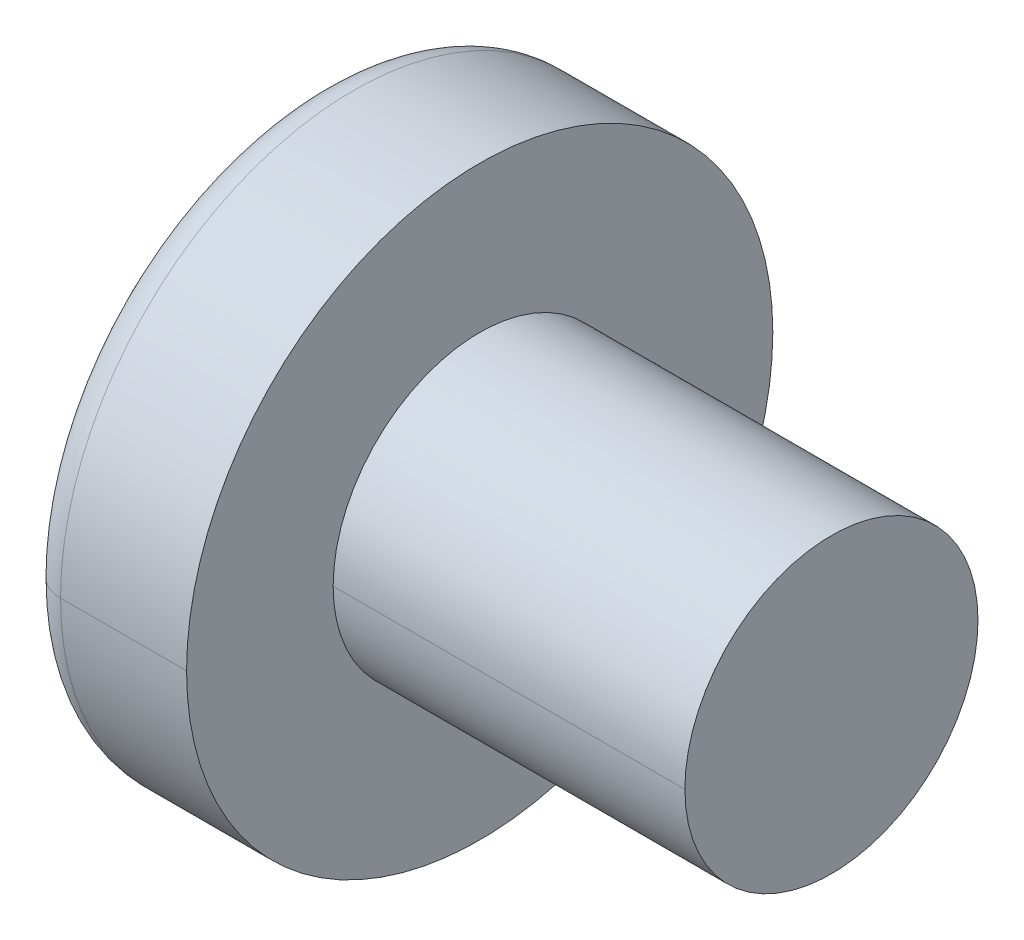
ISO-10303-21;
HEADER;
FILE_DESCRIPTION(('STEP AP214'),'2;1');
FILE_NAME('part.step','',(''),(''),'','','');
FILE_SCHEMA(('AUTOMOTIVE_DESIGN { 1 0 10303 214 1 1 1 1 }'));
ENDSEC;
DATA;
#1=APPLICATION_CONTEXT('core data for automotive mechanical design processes');
#2=APPLICATION_PROTOCOL_DEFINITION('international standard','automotive_design',2000,#1);
#3=PRODUCT_CONTEXT('',#1,'mechanical');
#4=PRODUCT('Part','Part','',(#3));
#5=PRODUCT_RELATED_PRODUCT_CATEGORY('part','',(#4));
#6=PRODUCT_DEFINITION_FORMATION('','',#4);
#7=PRODUCT_DEFINITION_CONTEXT('part definition',#1,'design');
#8=PRODUCT_DEFINITION('design','',#6,#7);
#9=PRODUCT_DEFINITION_SHAPE('','',#8);
#10=(LENGTH_UNIT() NAMED_UNIT(*) SI_UNIT(.MILLI.,.METRE.));
#11=(NAMED_UNIT(*) PLANE_ANGLE_UNIT() SI_UNIT($,.RADIAN.));
#12=(NAMED_UNIT(*) SI_UNIT($,.STERADIAN.) SOLID_ANGLE_UNIT());
#13=UNCERTAINTY_MEASURE_WITH_UNIT(LENGTH_MEASURE(1.E-05),#10,'distance_accuracy_value','');
#14=(GEOMETRIC_REPRESENTATION_CONTEXT(3) GLOBAL_UNCERTAINTY_ASSIGNED_CONTEXT((#13)) GLOBAL_UNIT_ASSIGNED_CONTEXT((#10,
#11,#12)) REPRESENTATION_CONTEXT('',''));
#15=CARTESIAN_POINT('',(0.,0.,0.));
#16=DIRECTION('',(0.,0.,1.));
#17=DIRECTION('',(1.,0.,0.));
#18=AXIS2_PLACEMENT_3D('',#15,#16,#17);
#19=CARTESIAN_POINT('',(1.0251050438713,0.,0.));
#20=DIRECTION('',(-1.,0.,0.));
#21=DIRECTION('',(0.,0.,1.));
#22=AXIS2_PLACEMENT_3D('',#19,#20,#21);
#23=TOROIDAL_SURFACE('',#22,2.2,0.3);
#24=CARTESIAN_POINT('',(1.0251050438713,0.,0.));
#25=DIRECTION('',(-1.,0.,0.));
#26=DIRECTION('',(0.,0.,1.));
#27=AXIS2_PLACEMENT_3D('',#24,#25,#26);
#28=CIRCLE('',#27,2.5);
#29=CARTESIAN_POINT('',(1.0251050438713,0.,2.5));
#30=VERTEX_POINT('',#29);
#31=CARTESIAN_POINT('',(1.0251050438713,0.,-2.5));
#32=VERTEX_POINT('',#31);
#33=EDGE_CURVE('E11',#30,#32,#28,.T.);
#34=ORIENTED_EDGE('',*,*,#33,.T.);
#35=CARTESIAN_POINT('',(1.0251050438713,0.,-2.2));
#36=DIRECTION('',(0.,1.,0.));
#37=DIRECTION('',(0.,0.,1.));
#38=AXIS2_PLACEMENT_3D('',#35,#36,#37);
#39=CIRCLE('',#38,0.3);
#40=CARTESIAN_POINT('',(0.783897344725726,0.,-2.37837837837838));
#41=VERTEX_POINT('',#40);
#42=EDGE_CURVE('E28',#32,#41,#39,.T.);
#43=ORIENTED_EDGE('',*,*,#42,.T.);
#44=CARTESIAN_POINT('',(0.783897344725726,0.,0.));
#45=DIRECTION('',(-1.,0.,0.));
#46=DIRECTION('',(0.,0.,1.));
#47=AXIS2_PLACEMENT_3D('',#44,#45,#46);
#48=CIRCLE('',#47,2.37837837837838);
#49=CARTESIAN_POINT('',(0.783897344725726,2.37837837837838,0.));
#50=VERTEX_POINT('',#49);
#51=EDGE_CURVE('E242',#50,#41,#48,.T.);
#52=ORIENTED_EDGE('',*,*,#51,.F.);
#53=CARTESIAN_POINT('',(0.783897344725726,0.,0.));
#54=DIRECTION('',(-1.,0.,0.));
#55=DIRECTION('',(0.,0.,1.));
#56=AXIS2_PLACEMENT_3D('',#53,#54,#55);
#57=CIRCLE('',#56,2.37837837837838);
#58=CARTESIAN_POINT('',(0.783897344725726,0.,2.37837837837838));
#59=VERTEX_POINT('',#58);
#60=EDGE_CURVE('E280',#59,#50,#57,.T.);
#61=ORIENTED_EDGE('',*,*,#60,.F.);
#62=CARTESIAN_POINT('',(1.0251050438713,0.,2.2));
#63=DIRECTION('',(0.,-1.,0.));
#64=DIRECTION('',(0.,0.,-1.));
#65=AXIS2_PLACEMENT_3D('',#62,#63,#64);
#66=CIRCLE('',#65,0.3);
#67=EDGE_CURVE('E204',#30,#59,#66,.T.);
#68=ORIENTED_EDGE('',*,*,#67,.F.);
#69=EDGE_LOOP('',(#34,#43,#52,#61,#68));
#70=FACE_BOUND('',#69,.T.);
#71=ADVANCED_FACE('F17',(#70),#23,.T.);
#72=CARTESIAN_POINT('',(-25.4,0.,0.));
#73=DIRECTION('',(-1.,0.,0.));
#74=DIRECTION('',(0.,0.,1.));
#75=AXIS2_PLACEMENT_3D('',#72,#73,#74);
#76=CYLINDRICAL_SURFACE('',#75,2.5);
#77=CARTESIAN_POINT('',(2.1,0.,0.));
#78=DIRECTION('',(-1.,0.,0.));
#79=DIRECTION('',(0.,0.,1.));
#80=AXIS2_PLACEMENT_3D('',#77,#78,#79);
#81=CIRCLE('',#80,2.5);
#82=CARTESIAN_POINT('',(2.1,0.,2.5));
#83=VERTEX_POINT('',#82);
#84=CARTESIAN_POINT('',(2.1,0.,-2.5));
#85=VERTEX_POINT('',#84);
#86=EDGE_CURVE('E214',#83,#85,#81,.T.);
#87=ORIENTED_EDGE('',*,*,#86,.T.);
#88=DIRECTION('',(-1.,0.,0.));
#89=VECTOR('',#88,1.);
#90=CARTESIAN_POINT('',(-25.4,0.,-2.5));
#91=LINE('',#90,#89);
#92=EDGE_CURVE('E43',#85,#32,#91,.T.);
#93=ORIENTED_EDGE('',*,*,#92,.T.);
#94=ORIENTED_EDGE('',*,*,#33,.F.);
#95=DIRECTION('',(-1.,0.,0.));
#96=VECTOR('',#95,1.);
#97=CARTESIAN_POINT('',(-25.4,0.,2.5));
#98=LINE('',#97,#96);
#99=EDGE_CURVE('E73',#83,#30,#98,.T.);
#100=ORIENTED_EDGE('',*,*,#99,.F.);
#101=EDGE_LOOP('',(#87,#93,#94,#100));
#102=FACE_BOUND('',#101,.T.);
#103=ADVANCED_FACE('F388',(#102),#76,.T.);
#104=CARTESIAN_POINT('',(-25.4,0.,0.));
#105=DIRECTION('',(-1.,0.,0.));
#106=DIRECTION('',(0.,0.,1.));
#107=AXIS2_PLACEMENT_3D('',#104,#105,#106);
#108=CYLINDRICAL_SURFACE('',#107,1.25);
#109=CARTESIAN_POINT('',(5.1,0.,0.));
#110=DIRECTION('',(-1.,0.,0.));
#111=DIRECTION('',(0.,0.,1.));
#112=AXIS2_PLACEMENT_3D('',#109,#110,#111);
#113=CIRCLE('',#112,1.25);
#114=CARTESIAN_POINT('',(5.1,0.,1.25));
#115=VERTEX_POINT('',#114);
#116=CARTESIAN_POINT('',(5.1,0.,-1.25));
#117=VERTEX_POINT('',#116);
#118=EDGE_CURVE('E298',#115,#117,#113,.T.);
#119=ORIENTED_EDGE('',*,*,#118,.T.);
#120=DIRECTION('',(-1.,0.,0.));
#121=VECTOR('',#120,1.);
#122=CARTESIAN_POINT('',(-25.4,0.,-1.25));
#123=LINE('',#122,#121);
#124=CARTESIAN_POINT('',(2.1,0.,-1.25));
#125=VERTEX_POINT('',#124);
#126=EDGE_CURVE('E245',#117,#125,#123,.T.);
#127=ORIENTED_EDGE('',*,*,#126,.T.);
#128=CARTESIAN_POINT('',(2.1,0.,0.));
#129=DIRECTION('',(-1.,0.,0.));
#130=DIRECTION('',(0.,0.,1.));
#131=AXIS2_PLACEMENT_3D('',#128,#129,#130);
#132=CIRCLE('',#131,1.25);
#133=CARTESIAN_POINT('',(2.1,0.,1.25));
#134=VERTEX_POINT('',#133);
#135=EDGE_CURVE('E230',#134,#125,#132,.T.);
#136=ORIENTED_EDGE('',*,*,#135,.F.);
#137=DIRECTION('',(-1.,0.,0.));
#138=VECTOR('',#137,1.);
#139=CARTESIAN_POINT('',(-25.4,0.,1.25));
#140=LINE('',#139,#138);
#141=EDGE_CURVE('E263',#115,#134,#140,.T.);
#142=ORIENTED_EDGE('',*,*,#141,.F.);
#143=EDGE_LOOP('',(#119,#127,#136,#142));
#144=FACE_BOUND('',#143,.T.);
#145=ADVANCED_FACE('F635',(#144),#108,.T.);
#146=CARTESIAN_POINT('',(4.,0.,0.));
#147=DIRECTION('',(0.,0.,-1.));
#148=DIRECTION('',(0.,1.,0.));
#149=AXIS2_PLACEMENT_3D('',#146,#147,#148);
#150=SPHERICAL_SURFACE('',#149,4.);
#151=ORIENTED_EDGE('',*,*,#51,.T.);
#152=CARTESIAN_POINT('',(0.783897344725726,0.,0.));
#153=DIRECTION('',(-1.,0.,0.));
#154=DIRECTION('',(0.,0.,1.));
#155=AXIS2_PLACEMENT_3D('',#152,#153,#154);
#156=CIRCLE('',#155,2.37837837837838);
#157=CARTESIAN_POINT('',(0.783897344725726,-2.37837837837838,0.));
#158=VERTEX_POINT('',#157);
#159=EDGE_CURVE('E241',#41,#158,#156,.T.);
#160=ORIENTED_EDGE('',*,*,#159,.T.);
#161=CARTESIAN_POINT('',(4.,0.,0.));
#162=DIRECTION('',(0.,0.,-1.));
#163=DIRECTION('',(0.,1.,0.));
#164=AXIS2_PLACEMENT_3D('',#161,#162,#163);
#165=CIRCLE('',#164,4.);
#166=CARTESIAN_POINT('',(0.184169682474743,-1.19976622216792,0.));
#167=VERTEX_POINT('',#166);
#168=EDGE_CURVE('E238',#158,#167,#165,.T.);
#169=ORIENTED_EDGE('',*,*,#168,.T.);
#170=CARTESIAN_POINT('',(3.17784904512422,1.07973473043772,0.));
#171=DIRECTION('',(0.605808178465614,-0.795610740817502,0.));
#172=DIRECTION('',(0.795610740817502,0.605808178465614,0.));
#173=AXIS2_PLACEMENT_3D('',#170,#171,#172);
#174=CIRCLE('',#173,3.76274377539628);
#175=CARTESIAN_POINT('',(0.195539940029893,-1.19110847703606,-0.327634320584816));
#176=VERTEX_POINT('',#175);
#177=EDGE_CURVE('E186',#167,#176,#174,.T.);
#178=ORIENTED_EDGE('',*,*,#177,.T.);
#179=CARTESIAN_POINT('',(3.98786118636742,0.,0.106127913473398));
#180=DIRECTION('',(-0.11363816050966,0.,0.993522203313031));
#181=DIRECTION('',(0.993522203313031,0.,0.11363816050966));
#182=AXIS2_PLACEMENT_3D('',#179,#180,#181);
#183=CIRCLE('',#182,3.99857343501221);
#184=CARTESIAN_POINT('',(0.0301382525496408,-0.346552814250857,-0.346552814250858));
#185=VERTEX_POINT('',#184);
#186=EDGE_CURVE('E220',#185,#176,#183,.T.);
#187=ORIENTED_EDGE('',*,*,#186,.F.);
#188=CARTESIAN_POINT('',(3.98786118636742,0.106127913473398,0.));
#189=DIRECTION('',(-0.11363816050966,0.993522203313031,0.));
#190=DIRECTION('',(-0.993522203313031,-0.11363816050966,0.));
#191=AXIS2_PLACEMENT_3D('',#188,#189,#190);
#192=CIRCLE('',#191,3.99857343501221);
#193=CARTESIAN_POINT('',(0.195539940029893,-0.327634320584812,-1.19110847703606));
#194=VERTEX_POINT('',#193);
#195=EDGE_CURVE('E252',#194,#185,#192,.T.);
#196=ORIENTED_EDGE('',*,*,#195,.F.);
#197=CARTESIAN_POINT('',(3.17784904512422,0.,1.07973473043772));
#198=DIRECTION('',(0.605808178465614,0.,-0.795610740817502));
#199=DIRECTION('',(-0.795610740817502,0.,-0.605808178465614));
#200=AXIS2_PLACEMENT_3D('',#197,#198,#199);
#201=CIRCLE('',#200,3.76274377539628);
#202=CARTESIAN_POINT('',(0.195539940029893,0.327634320584821,-1.19110847703606));
#203=VERTEX_POINT('',#202);
#204=EDGE_CURVE('E250',#194,#203,#201,.T.);
#205=ORIENTED_EDGE('',*,*,#204,.T.);
#206=CARTESIAN_POINT('',(3.98786118636742,-0.106127913473398,0.));
#207=DIRECTION('',(-0.11363816050966,-0.993522203313031,0.));
#208=DIRECTION('',(0.993522203313031,-0.11363816050966,0.));
#209=AXIS2_PLACEMENT_3D('',#206,#207,#208);
#210=CIRCLE('',#209,3.99857343501221);
#211=CARTESIAN_POINT('',(0.0301382525496408,0.34655281425086,-0.346552814250858));
#212=VERTEX_POINT('',#211);
#213=EDGE_CURVE('E236',#212,#203,#210,.T.);
#214=ORIENTED_EDGE('',*,*,#213,.F.);
#215=CARTESIAN_POINT('',(3.98786118636742,0.,0.106127913473398));
#216=DIRECTION('',(-0.11363816050966,0.,0.993522203313031));
#217=DIRECTION('',(0.993522203313031,0.,0.11363816050966));
#218=AXIS2_PLACEMENT_3D('',#215,#216,#217);
#219=CIRCLE('',#218,3.99857343501221);
#220=CARTESIAN_POINT('',(0.195539940029893,1.19110847703606,-0.327634320584817));
#221=VERTEX_POINT('',#220);
#222=EDGE_CURVE('E190',#221,#212,#219,.T.);
#223=ORIENTED_EDGE('',*,*,#222,.F.);
#224=CARTESIAN_POINT('',(3.17784904512422,-1.07973473043772,0.));
#225=DIRECTION('',(0.605808178465614,0.795610740817502,0.));
#226=DIRECTION('',(-0.795610740817502,0.605808178465614,0.));
#227=AXIS2_PLACEMENT_3D('',#224,#225,#226);
#228=CIRCLE('',#227,3.76274377539628);
#229=CARTESIAN_POINT('',(0.184169682474743,1.19976622216792,0.));
#230=VERTEX_POINT('',#229);
#231=EDGE_CURVE('E246',#221,#230,#228,.T.);
#232=ORIENTED_EDGE('',*,*,#231,.T.);
#233=CARTESIAN_POINT('',(4.,0.,0.));
#234=DIRECTION('',(0.,0.,1.));
#235=DIRECTION('',(1.,0.,0.));
#236=AXIS2_PLACEMENT_3D('',#233,#234,#235);
#237=CIRCLE('',#236,4.);
#238=EDGE_CURVE('E287',#50,#230,#237,.T.);
#239=ORIENTED_EDGE('',*,*,#238,.F.);
#240=EDGE_LOOP('',(#151,#160,#169,#178,#187,#196,#205,#214,#223,#232,#239));
#241=FACE_BOUND('',#240,.T.);
#242=ADVANCED_FACE('F353',(#241),#150,.T.);
#243=CARTESIAN_POINT('',(4.,0.,0.));
#244=DIRECTION('',(0.,0.,-1.));
#245=DIRECTION('',(0.,1.,0.));
#246=AXIS2_PLACEMENT_3D('',#243,#244,#245);
#247=SPHERICAL_SURFACE('',#246,4.);
#248=ORIENTED_EDGE('',*,*,#168,.F.);
#249=CARTESIAN_POINT('',(0.783897344725726,0.,0.));
#250=DIRECTION('',(-1.,0.,0.));
#251=DIRECTION('',(0.,0.,1.));
#252=AXIS2_PLACEMENT_3D('',#249,#250,#251);
#253=CIRCLE('',#252,2.37837837837838);
#254=EDGE_CURVE('E251',#158,#59,#253,.T.);
#255=ORIENTED_EDGE('',*,*,#254,.T.);
#256=ORIENTED_EDGE('',*,*,#60,.T.);
#257=ORIENTED_EDGE('',*,*,#238,.T.);
#258=CARTESIAN_POINT('',(3.17784904512422,-1.07973473043772,0.));
#259=DIRECTION('',(0.605808178465614,0.795610740817502,0.));
#260=DIRECTION('',(-0.795610740817502,0.605808178465614,0.));
#261=AXIS2_PLACEMENT_3D('',#258,#259,#260);
#262=CIRCLE('',#261,3.76274377539628);
#263=CARTESIAN_POINT('',(0.195539940029893,1.19110847703606,0.327634320584817));
#264=VERTEX_POINT('',#263);
#265=EDGE_CURVE('E283',#230,#264,#262,.T.);
#266=ORIENTED_EDGE('',*,*,#265,.T.);
#267=CARTESIAN_POINT('',(3.98786118636742,0.,-0.106127913473398));
#268=DIRECTION('',(-0.11363816050966,0.,-0.993522203313031));
#269=DIRECTION('',(-0.993522203313031,0.,0.11363816050966));
#270=AXIS2_PLACEMENT_3D('',#267,#268,#269);
#271=CIRCLE('',#270,3.99857343501221);
#272=CARTESIAN_POINT('',(0.0301382525496408,0.346552814250857,0.346552814250858));
#273=VERTEX_POINT('',#272);
#274=EDGE_CURVE('E176',#273,#264,#271,.T.);
#275=ORIENTED_EDGE('',*,*,#274,.F.);
#276=CARTESIAN_POINT('',(3.98786118636742,-0.106127913473398,0.));
#277=DIRECTION('',(-0.11363816050966,-0.993522203313031,0.));
#278=DIRECTION('',(0.993522203313031,-0.11363816050966,0.));
#279=AXIS2_PLACEMENT_3D('',#276,#277,#278);
#280=CIRCLE('',#279,3.99857343501221);
#281=CARTESIAN_POINT('',(0.195539940029893,0.327634320584812,1.19110847703606));
#282=VERTEX_POINT('',#281);
#283=EDGE_CURVE('E256',#282,#273,#280,.T.);
#284=ORIENTED_EDGE('',*,*,#283,.F.);
#285=CARTESIAN_POINT('',(3.17784904512422,0.,-1.07973473043772));
#286=DIRECTION('',(0.605808178465614,0.,0.795610740817502));
#287=DIRECTION('',(0.795610740817502,0.,-0.605808178465614));
#288=AXIS2_PLACEMENT_3D('',#285,#286,#287);
#289=CIRCLE('',#288,3.76274377539628);
#290=CARTESIAN_POINT('',(0.195539940029893,-0.327634320584821,1.19110847703606));
#291=VERTEX_POINT('',#290);
#292=EDGE_CURVE('E189',#282,#291,#289,.T.);
#293=ORIENTED_EDGE('',*,*,#292,.T.);
#294=CARTESIAN_POINT('',(3.98786118636742,0.106127913473398,0.));
#295=DIRECTION('',(-0.11363816050966,0.993522203313031,0.));
#296=DIRECTION('',(-0.993522203313031,-0.11363816050966,0.));
#297=AXIS2_PLACEMENT_3D('',#294,#295,#296);
#298=CIRCLE('',#297,3.99857343501221);
#299=CARTESIAN_POINT('',(0.0301382525496408,-0.34655281425086,0.346552814250858));
#300=VERTEX_POINT('',#299);
#301=EDGE_CURVE('E170',#300,#291,#298,.T.);
#302=ORIENTED_EDGE('',*,*,#301,.F.);
#303=CARTESIAN_POINT('',(3.98786118636742,0.,-0.106127913473398));
#304=DIRECTION('',(-0.11363816050966,0.,-0.993522203313031));
#305=DIRECTION('',(-0.993522203313031,0.,0.11363816050966));
#306=AXIS2_PLACEMENT_3D('',#303,#304,#305);
#307=CIRCLE('',#306,3.99857343501221);
#308=CARTESIAN_POINT('',(0.195539940029893,-1.19110847703606,0.327634320584816));
#309=VERTEX_POINT('',#308);
#310=EDGE_CURVE('E164',#309,#300,#307,.T.);
#311=ORIENTED_EDGE('',*,*,#310,.F.);
#312=CARTESIAN_POINT('',(3.17784904512422,1.07973473043772,0.));
#313=DIRECTION('',(0.605808178465614,-0.795610740817502,0.));
#314=DIRECTION('',(0.795610740817502,0.605808178465614,0.));
#315=AXIS2_PLACEMENT_3D('',#312,#313,#314);
#316=CIRCLE('',#315,3.76274377539628);
#317=EDGE_CURVE('E167',#309,#167,#316,.T.);
#318=ORIENTED_EDGE('',*,*,#317,.T.);
#319=EDGE_LOOP('',(#248,#255,#256,#257,#266,#275,#284,#293,#302,#311,#318));
#320=FACE_BOUND('',#319,.T.);
#321=ADVANCED_FACE('F166',(#320),#247,.T.);
#322=CARTESIAN_POINT('',(1.75982832618026,0.,-0.148712446351931));
#323=DIRECTION('',(-0.11363816050966,0.,0.993522203313031));
#324=DIRECTION('',(0.,1.,0.));
#325=AXIS2_PLACEMENT_3D('',#322,#323,#324);
#326=PLANE('',#325);
#327=ORIENTED_EDGE('',*,*,#222,.T.);
#328=DIRECTION('',(0.987168682960152,-0.112911450665377,0.112911450665377));
#329=VECTOR('',#328,1.);
#330=CARTESIAN_POINT('',(1.77640420924781,0.146816512014139,-0.146816512014139));
#331=LINE('',#330,#329);
#332=CARTESIAN_POINT('',(1.53,0.175,-0.175));
#333=VERTEX_POINT('',#332);
#334=EDGE_CURVE('E318',#212,#333,#331,.T.);
#335=ORIENTED_EDGE('',*,*,#334,.T.);
#336=DIRECTION('',(0.792336746135061,-0.603315234802187,0.0906267520089122));
#337=VECTOR('',#336,1.);
#338=CARTESIAN_POINT('',(0.,1.34,-0.35));
#339=LINE('',#338,#337);
#340=EDGE_CURVE('E195',#221,#333,#339,.T.);
#341=ORIENTED_EDGE('',*,*,#340,.F.);
#342=EDGE_LOOP('',(#327,#335,#341));
#343=FACE_BOUND('',#342,.T.);
#344=ADVANCED_FACE('F407',(#343),#326,.T.);
#345=CARTESIAN_POINT('',(1.75982832618026,0.,-0.148712446351931));
#346=DIRECTION('',(-0.11363816050966,0.,0.993522203313031));
#347=DIRECTION('',(0.,1.,0.));
#348=AXIS2_PLACEMENT_3D('',#345,#346,#347);
#349=PLANE('',#348);
#350=DIRECTION('',(0.792336746135061,0.603315234802187,0.0906267520089122));
#351=VECTOR('',#350,1.);
#352=CARTESIAN_POINT('',(0.,-1.34,-0.35));
#353=LINE('',#352,#351);
#354=CARTESIAN_POINT('',(1.53,-0.175,-0.175));
#355=VERTEX_POINT('',#354);
#356=EDGE_CURVE('E21',#176,#355,#353,.T.);
#357=ORIENTED_EDGE('',*,*,#356,.T.);
#358=DIRECTION('',(-0.987168682960152,-0.112911450665376,-0.112911450665377));
#359=VECTOR('',#358,1.);
#360=CARTESIAN_POINT('',(1.77640420924781,-0.146816512014138,-0.146816512014139));
#361=LINE('',#360,#359);
#362=EDGE_CURVE('E216',#355,#185,#361,.T.);
#363=ORIENTED_EDGE('',*,*,#362,.T.);
#364=ORIENTED_EDGE('',*,*,#186,.T.);
#365=EDGE_LOOP('',(#357,#363,#364));
#366=FACE_BOUND('',#365,.T.);
#367=ADVANCED_FACE('F569',(#366),#349,.T.);
#368=CARTESIAN_POINT('',(1.75982832618026,0.,0.148712446351931));
#369=DIRECTION('',(-0.11363816050966,0.,-0.993522203313031));
#370=DIRECTION('',(-0.993522203313031,0.,0.11363816050966));
#371=AXIS2_PLACEMENT_3D('',#368,#369,#370);
#372=PLANE('',#371);
#373=DIRECTION('',(0.792336746135061,-0.603315234802187,-0.0906267520089122));
#374=VECTOR('',#373,1.);
#375=CARTESIAN_POINT('',(0.,1.34,0.35));
#376=LINE('',#375,#374);
#377=CARTESIAN_POINT('',(1.53,0.175,0.175));
#378=VERTEX_POINT('',#377);
#379=EDGE_CURVE('E221',#264,#378,#376,.T.);
#380=ORIENTED_EDGE('',*,*,#379,.T.);
#381=DIRECTION('',(-0.987168682960152,0.112911450665376,0.112911450665377));
#382=VECTOR('',#381,1.);
#383=CARTESIAN_POINT('',(1.77640420924781,0.146816512014138,0.146816512014139));
#384=LINE('',#383,#382);
#385=EDGE_CURVE('E225',#378,#273,#384,.T.);
#386=ORIENTED_EDGE('',*,*,#385,.T.);
#387=ORIENTED_EDGE('',*,*,#274,.T.);
#388=EDGE_LOOP('',(#380,#386,#387));
#389=FACE_BOUND('',#388,.T.);
#390=ADVANCED_FACE('F360',(#389),#372,.T.);
#391=CARTESIAN_POINT('',(1.75982832618026,0.,0.148712446351931));
#392=DIRECTION('',(-0.11363816050966,0.,-0.993522203313031));
#393=DIRECTION('',(-0.993522203313031,0.,0.11363816050966));
#394=AXIS2_PLACEMENT_3D('',#391,#392,#393);
#395=PLANE('',#394);
#396=ORIENTED_EDGE('',*,*,#310,.T.);
#397=DIRECTION('',(0.987168682960152,0.112911450665377,-0.112911450665377));
#398=VECTOR('',#397,1.);
#399=CARTESIAN_POINT('',(1.77640420924781,-0.14681651201414,0.146816512014139));
#400=LINE('',#399,#398);
#401=CARTESIAN_POINT('',(1.53,-0.175,0.175));
#402=VERTEX_POINT('',#401);
#403=EDGE_CURVE('E177',#300,#402,#400,.T.);
#404=ORIENTED_EDGE('',*,*,#403,.T.);
#405=DIRECTION('',(0.792336746135061,0.603315234802187,-0.0906267520089121));
#406=VECTOR('',#405,1.);
#407=CARTESIAN_POINT('',(0.,-1.34,0.35));
#408=LINE('',#407,#406);
#409=EDGE_CURVE('E183',#309,#402,#408,.T.);
#410=ORIENTED_EDGE('',*,*,#409,.F.);
#411=EDGE_LOOP('',(#396,#404,#410));
#412=FACE_BOUND('',#411,.T.);
#413=ADVANCED_FACE('F192',(#412),#395,.T.);
#414=CARTESIAN_POINT('',(-25.4,0.,0.));
#415=DIRECTION('',(-1.,0.,0.));
#416=DIRECTION('',(0.,0.,1.));
#417=AXIS2_PLACEMENT_3D('',#414,#415,#416);
#418=CYLINDRICAL_SURFACE('',#417,1.25);
#419=ORIENTED_EDGE('',*,*,#126,.F.);
#420=CARTESIAN_POINT('',(5.1,0.,0.));
#421=DIRECTION('',(-1.,0.,0.));
#422=DIRECTION('',(0.,0.,1.));
#423=AXIS2_PLACEMENT_3D('',#420,#421,#422);
#424=CIRCLE('',#423,1.25);
#425=EDGE_CURVE('E259',#117,#115,#424,.T.);
#426=ORIENTED_EDGE('',*,*,#425,.T.);
#427=ORIENTED_EDGE('',*,*,#141,.T.);
#428=CARTESIAN_POINT('',(2.1,0.,0.));
#429=DIRECTION('',(-1.,0.,0.));
#430=DIRECTION('',(0.,0.,1.));
#431=AXIS2_PLACEMENT_3D('',#428,#429,#430);
#432=CIRCLE('',#431,1.25);
#433=EDGE_CURVE('E226',#125,#134,#432,.T.);
#434=ORIENTED_EDGE('',*,*,#433,.F.);
#435=EDGE_LOOP('',(#419,#426,#427,#434));
#436=FACE_BOUND('',#435,.T.);
#437=ADVANCED_FACE('F627',(#436),#418,.T.);
#438=CARTESIAN_POINT('',(2.1,1.25,0.));
#439=DIRECTION('',(-1.,0.,0.));
#440=DIRECTION('',(0.,0.,1.));
#441=AXIS2_PLACEMENT_3D('',#438,#439,#440);
#442=PLANE('',#441);
#443=ORIENTED_EDGE('',*,*,#86,.F.);
#444=CARTESIAN_POINT('',(2.1,0.,0.));
#445=DIRECTION('',(-1.,0.,0.));
#446=DIRECTION('',(0.,0.,1.));
#447=AXIS2_PLACEMENT_3D('',#444,#445,#446);
#448=CIRCLE('',#447,2.5);
#449=EDGE_CURVE('E231',#85,#83,#448,.T.);
#450=ORIENTED_EDGE('',*,*,#449,.F.);
#451=EDGE_LOOP('',(#443,#450));
#452=FACE_BOUND('',#451,.T.);
#453=ORIENTED_EDGE('',*,*,#135,.T.);
#454=ORIENTED_EDGE('',*,*,#433,.T.);
#455=EDGE_LOOP('',(#453,#454));
#456=FACE_BOUND('',#455,.T.);
#457=ADVANCED_FACE('F643',(#452,#456),#442,.F.);
#458=CARTESIAN_POINT('',(-25.4,0.,0.));
#459=DIRECTION('',(-1.,0.,0.));
#460=DIRECTION('',(0.,0.,1.));
#461=AXIS2_PLACEMENT_3D('',#458,#459,#460);
#462=CYLINDRICAL_SURFACE('',#461,2.5);
#463=ORIENTED_EDGE('',*,*,#92,.F.);
#464=ORIENTED_EDGE('',*,*,#449,.T.);
#465=ORIENTED_EDGE('',*,*,#99,.T.);
#466=CARTESIAN_POINT('',(1.0251050438713,0.,0.));
#467=DIRECTION('',(-1.,0.,0.));
#468=DIRECTION('',(0.,0.,1.));
#469=AXIS2_PLACEMENT_3D('',#466,#467,#468);
#470=CIRCLE('',#469,2.5);
#471=EDGE_CURVE('E264',#32,#30,#470,.T.);
#472=ORIENTED_EDGE('',*,*,#471,.F.);
#473=EDGE_LOOP('',(#463,#464,#465,#472));
#474=FACE_BOUND('',#473,.T.);
#475=ADVANCED_FACE('F386',(#474),#462,.T.);
#476=CARTESIAN_POINT('',(1.0251050438713,0.,0.));
#477=DIRECTION('',(-1.,0.,0.));
#478=DIRECTION('',(0.,0.,1.));
#479=AXIS2_PLACEMENT_3D('',#476,#477,#478);
#480=TOROIDAL_SURFACE('',#479,2.2,0.3);
#481=ORIENTED_EDGE('',*,*,#42,.F.);
#482=ORIENTED_EDGE('',*,*,#471,.T.);
#483=ORIENTED_EDGE('',*,*,#67,.T.);
#484=ORIENTED_EDGE('',*,*,#254,.F.);
#485=ORIENTED_EDGE('',*,*,#159,.F.);
#486=EDGE_LOOP('',(#481,#482,#483,#484,#485));
#487=FACE_BOUND('',#486,.T.);
#488=ADVANCED_FACE('F391',(#487),#480,.T.);
#489=CARTESIAN_POINT('',(5.1,1.25,0.));
#490=DIRECTION('',(1.,0.,0.));
#491=DIRECTION('',(0.,1.,0.));
#492=AXIS2_PLACEMENT_3D('',#489,#490,#491);
#493=PLANE('',#492);
#494=ORIENTED_EDGE('',*,*,#118,.F.);
#495=ORIENTED_EDGE('',*,*,#425,.F.);
#496=EDGE_LOOP('',(#494,#495));
#497=FACE_BOUND('',#496,.T.);
#498=ADVANCED_FACE('F557',(#497),#493,.T.);
#499=CARTESIAN_POINT('',(1.53,0.175,0.175));
#500=DIRECTION('',(0.605808178465614,0.795610740817502,0.));
#501=DIRECTION('',(0.,0.,-1.));
#502=AXIS2_PLACEMENT_3D('',#499,#500,#501);
#503=PLANE('',#502);
#504=ORIENTED_EDGE('',*,*,#340,.T.);
#505=DIRECTION('',(0.,0.,-1.));
#506=VECTOR('',#505,1.);
#507=CARTESIAN_POINT('',(1.53,0.175,0.175));
#508=LINE('',#507,#506);
#509=EDGE_CURVE('E208',#378,#333,#508,.T.);
#510=ORIENTED_EDGE('',*,*,#509,.F.);
#511=ORIENTED_EDGE('',*,*,#379,.F.);
#512=ORIENTED_EDGE('',*,*,#265,.F.);
#513=ORIENTED_EDGE('',*,*,#231,.F.);
#514=EDGE_LOOP('',(#504,#510,#511,#512,#513));
#515=FACE_BOUND('',#514,.T.);
#516=ADVANCED_FACE('F356',(#515),#503,.F.);
#517=CARTESIAN_POINT('',(1.53,-0.175,-0.175));
#518=DIRECTION('',(0.605808178465614,-0.795610740817502,0.));
#519=DIRECTION('',(0.,0.,-1.));
#520=AXIS2_PLACEMENT_3D('',#517,#518,#519);
#521=PLANE('',#520);
#522=ORIENTED_EDGE('',*,*,#409,.T.);
#523=DIRECTION('',(0.,0.,1.));
#524=VECTOR('',#523,1.);
#525=CARTESIAN_POINT('',(1.53,-0.175,-0.175));
#526=LINE('',#525,#524);
#527=EDGE_CURVE('E196',#355,#402,#526,.T.);
#528=ORIENTED_EDGE('',*,*,#527,.F.);
#529=ORIENTED_EDGE('',*,*,#356,.F.);
#530=ORIENTED_EDGE('',*,*,#177,.F.);
#531=ORIENTED_EDGE('',*,*,#317,.F.);
#532=EDGE_LOOP('',(#522,#528,#529,#530,#531));
#533=FACE_BOUND('',#532,.T.);
#534=ADVANCED_FACE('F181',(#533),#521,.F.);
#535=CARTESIAN_POINT('',(1.53,0.175,-0.175));
#536=DIRECTION('',(-1.,0.,0.));
#537=DIRECTION('',(0.,0.,1.));
#538=AXIS2_PLACEMENT_3D('',#535,#536,#537);
#539=PLANE('',#538);
#540=DIRECTION('',(0.,1.,0.));
#541=VECTOR('',#540,1.);
#542=CARTESIAN_POINT('',(1.53,-0.175,-0.175));
#543=LINE('',#542,#541);
#544=EDGE_CURVE('E255',#355,#333,#543,.T.);
#545=ORIENTED_EDGE('',*,*,#544,.F.);
#546=ORIENTED_EDGE('',*,*,#527,.T.);
#547=DIRECTION('',(0.,-1.,0.));
#548=VECTOR('',#547,1.);
#549=CARTESIAN_POINT('',(1.53,0.175,0.175));
#550=LINE('',#549,#548);
#551=EDGE_CURVE('E212',#378,#402,#550,.T.);
#552=ORIENTED_EDGE('',*,*,#551,.F.);
#553=ORIENTED_EDGE('',*,*,#509,.T.);
#554=EDGE_LOOP('',(#545,#546,#552,#553));
#555=FACE_BOUND('',#554,.T.);
#556=ADVANCED_FACE('F416',(#555),#539,.T.);
#557=CARTESIAN_POINT('',(1.53,0.175,-0.175));
#558=DIRECTION('',(0.605808178465614,0.,-0.795610740817502));
#559=DIRECTION('',(0.,-1.,0.));
#560=AXIS2_PLACEMENT_3D('',#557,#558,#559);
#561=PLANE('',#560);
#562=DIRECTION('',(0.792336746135061,0.09062675200891,0.603315234802188));
#563=VECTOR('',#562,1.);
#564=CARTESIAN_POINT('',(0.,-0.349999999999995,-1.34));
#565=LINE('',#564,#563);
#566=EDGE_CURVE('E268',#194,#355,#565,.T.);
#567=ORIENTED_EDGE('',*,*,#566,.T.);
#568=ORIENTED_EDGE('',*,*,#544,.T.);
#569=DIRECTION('',(0.792336746135061,-0.0906267520089144,0.603315234802187));
#570=VECTOR('',#569,1.);
#571=CARTESIAN_POINT('',(0.,0.350000000000004,-1.34));
#572=LINE('',#571,#570);
#573=EDGE_CURVE('E232',#203,#333,#572,.T.);
#574=ORIENTED_EDGE('',*,*,#573,.F.);
#575=ORIENTED_EDGE('',*,*,#204,.F.);
#576=EDGE_LOOP('',(#567,#568,#574,#575));
#577=FACE_BOUND('',#576,.T.);
#578=ADVANCED_FACE('F413',(#577),#561,.F.);
#579=CARTESIAN_POINT('',(1.75982832618026,-0.148712446351931,0.));
#580=DIRECTION('',(-0.11363816050966,0.993522203313031,0.));
#581=DIRECTION('',(0.,0.,1.));
#582=AXIS2_PLACEMENT_3D('',#579,#580,#581);
#583=PLANE('',#582);
#584=ORIENTED_EDGE('',*,*,#195,.T.);
#585=ORIENTED_EDGE('',*,*,#362,.F.);
#586=ORIENTED_EDGE('',*,*,#566,.F.);
#587=EDGE_LOOP('',(#584,#585,#586));
#588=FACE_BOUND('',#587,.T.);
#589=ADVANCED_FACE('F619',(#588),#583,.T.);
#590=CARTESIAN_POINT('',(1.75982832618026,0.148712446351931,0.));
#591=DIRECTION('',(-0.11363816050966,-0.993522203313031,0.));
#592=DIRECTION('',(-0.993522203313031,0.11363816050966,0.));
#593=AXIS2_PLACEMENT_3D('',#590,#591,#592);
#594=PLANE('',#593);
#595=ORIENTED_EDGE('',*,*,#213,.T.);
#596=ORIENTED_EDGE('',*,*,#573,.T.);
#597=ORIENTED_EDGE('',*,*,#334,.F.);
#598=EDGE_LOOP('',(#595,#596,#597));
#599=FACE_BOUND('',#598,.T.);
#600=ADVANCED_FACE('F410',(#599),#594,.T.);
#601=CARTESIAN_POINT('',(1.53,-0.175,0.175));
#602=DIRECTION('',(0.605808178465614,0.,0.795610740817502));
#603=DIRECTION('',(0.,-1.,0.));
#604=AXIS2_PLACEMENT_3D('',#601,#602,#603);
#605=PLANE('',#604);
#606=DIRECTION('',(0.792336746135061,-0.0906267520089101,-0.603315234802188));
#607=VECTOR('',#606,1.);
#608=CARTESIAN_POINT('',(0.,0.349999999999995,1.34));
#609=LINE('',#608,#607);
#610=EDGE_CURVE('E237',#282,#378,#609,.T.);
#611=ORIENTED_EDGE('',*,*,#610,.T.);
#612=ORIENTED_EDGE('',*,*,#551,.T.);
#613=DIRECTION('',(0.792336746135061,0.0906267520089144,-0.603315234802187));
#614=VECTOR('',#613,1.);
#615=CARTESIAN_POINT('',(0.,-0.350000000000004,1.34));
#616=LINE('',#615,#614);
#617=EDGE_CURVE('E272',#291,#402,#616,.T.);
#618=ORIENTED_EDGE('',*,*,#617,.F.);
#619=ORIENTED_EDGE('',*,*,#292,.F.);
#620=EDGE_LOOP('',(#611,#612,#618,#619));
#621=FACE_BOUND('',#620,.T.);
#622=ADVANCED_FACE('F365',(#621),#605,.F.);
#623=CARTESIAN_POINT('',(1.75982832618026,0.148712446351931,0.));
#624=DIRECTION('',(-0.11363816050966,-0.993522203313031,0.));
#625=DIRECTION('',(-0.993522203313031,0.11363816050966,0.));
#626=AXIS2_PLACEMENT_3D('',#623,#624,#625);
#627=PLANE('',#626);
#628=ORIENTED_EDGE('',*,*,#283,.T.);
#629=ORIENTED_EDGE('',*,*,#385,.F.);
#630=ORIENTED_EDGE('',*,*,#610,.F.);
#631=EDGE_LOOP('',(#628,#629,#630));
#632=FACE_BOUND('',#631,.T.);
#633=ADVANCED_FACE('F368',(#632),#627,.T.);
#634=CARTESIAN_POINT('',(1.75982832618026,-0.148712446351931,0.));
#635=DIRECTION('',(-0.11363816050966,0.993522203313031,0.));
#636=DIRECTION('',(0.,0.,1.));
#637=AXIS2_PLACEMENT_3D('',#634,#635,#636);
#638=PLANE('',#637);
#639=ORIENTED_EDGE('',*,*,#301,.T.);
#640=ORIENTED_EDGE('',*,*,#617,.T.);
#641=ORIENTED_EDGE('',*,*,#403,.F.);
#642=EDGE_LOOP('',(#639,#640,#641));
#643=FACE_BOUND('',#642,.T.);
#644=ADVANCED_FACE('F19',(#643),#638,.T.);
#645=CLOSED_SHELL('',(#71,#103,#145,#242,#321,#344,#367,#390,#413,#437,#457,#475,#488,#498,#516,
#534,#556,#578,#589,#600,#622,#633,#644));
#646=MANIFOLD_SOLID_BREP('B1',#645);
#647=ADVANCED_BREP_SHAPE_REPRESENTATION('',(#18,#646),#14);
#648=SHAPE_DEFINITION_REPRESENTATION(#9,#647);
ENDSEC;
END-ISO-10303-21;
